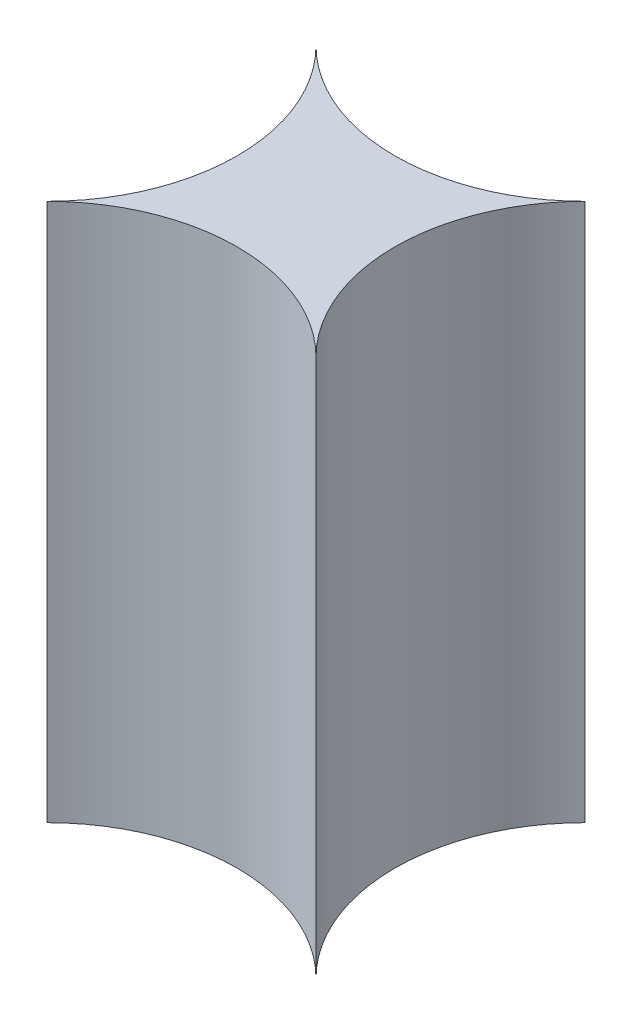
ISO-10303-21;
HEADER;
FILE_DESCRIPTION(('STEP AP214'),'2;1');
FILE_NAME('part.step','',(''),(''),'','','');
FILE_SCHEMA(('AUTOMOTIVE_DESIGN { 1 0 10303 214 1 1 1 1 }'));
ENDSEC;
DATA;
#1=APPLICATION_CONTEXT('core data for automotive mechanical design processes');
#2=APPLICATION_PROTOCOL_DEFINITION('international standard','automotive_design',2000,#1);
#3=PRODUCT_CONTEXT('',#1,'mechanical');
#4=PRODUCT('Part','Part','',(#3));
#5=PRODUCT_RELATED_PRODUCT_CATEGORY('part','',(#4));
#6=PRODUCT_DEFINITION_FORMATION('','',#4);
#7=PRODUCT_DEFINITION_CONTEXT('part definition',#1,'design');
#8=PRODUCT_DEFINITION('design','',#6,#7);
#9=PRODUCT_DEFINITION_SHAPE('','',#8);
#10=(LENGTH_UNIT() NAMED_UNIT(*) SI_UNIT(.MILLI.,.METRE.));
#11=(NAMED_UNIT(*) PLANE_ANGLE_UNIT() SI_UNIT($,.RADIAN.));
#12=(NAMED_UNIT(*) SI_UNIT($,.STERADIAN.) SOLID_ANGLE_UNIT());
#13=UNCERTAINTY_MEASURE_WITH_UNIT(LENGTH_MEASURE(1.E-05),#10,'distance_accuracy_value','');
#14=(GEOMETRIC_REPRESENTATION_CONTEXT(3) GLOBAL_UNCERTAINTY_ASSIGNED_CONTEXT((#13)) GLOBAL_UNIT_ASSIGNED_CONTEXT((#10,
#11,#12)) REPRESENTATION_CONTEXT('',''));
#15=CARTESIAN_POINT('',(0.,0.,0.));
#16=DIRECTION('',(0.,0.,1.));
#17=DIRECTION('',(1.,0.,0.));
#18=AXIS2_PLACEMENT_3D('',#15,#16,#17);
#19=CARTESIAN_POINT('',(0.,10.,-5.));
#20=DIRECTION('',(0.,-1.,0.));
#21=DIRECTION('',(0.,0.,-1.));
#22=AXIS2_PLACEMENT_3D('',#19,#20,#21);
#23=CYLINDRICAL_SURFACE('',#22,3.53553390593274);
#24=CARTESIAN_POINT('',(0.,0.,-5.));
#25=DIRECTION('',(0.,1.,0.));
#26=DIRECTION('',(0.,0.,1.));
#27=AXIS2_PLACEMENT_3D('',#24,#25,#26);
#28=CIRCLE('',#27,3.53553390593274);
#29=CARTESIAN_POINT('',(-2.5,0.,-2.5));
#30=VERTEX_POINT('',#29);
#31=CARTESIAN_POINT('',(2.5,0.,-2.50000000000001));
#32=VERTEX_POINT('',#31);
#33=EDGE_CURVE('E110',#30,#32,#28,.T.);
#34=ORIENTED_EDGE('',*,*,#33,.F.);
#35=DIRECTION('',(0.,-1.,0.));
#36=VECTOR('',#35,1.);
#37=CARTESIAN_POINT('',(-2.5,10.,-2.5));
#38=LINE('',#37,#36);
#39=CARTESIAN_POINT('',(-2.5,10.,-2.5));
#40=VERTEX_POINT('',#39);
#41=EDGE_CURVE('E11',#40,#30,#38,.T.);
#42=ORIENTED_EDGE('',*,*,#41,.F.);
#43=CARTESIAN_POINT('',(0.,10.,-5.));
#44=DIRECTION('',(0.,1.,0.));
#45=DIRECTION('',(0.,0.,1.));
#46=AXIS2_PLACEMENT_3D('',#43,#44,#45);
#47=CIRCLE('',#46,3.53553390593274);
#48=CARTESIAN_POINT('',(2.5,10.,-2.50000000000001));
#49=VERTEX_POINT('',#48);
#50=EDGE_CURVE('E103',#40,#49,#47,.T.);
#51=ORIENTED_EDGE('',*,*,#50,.T.);
#52=DIRECTION('',(0.,-1.,0.));
#53=VECTOR('',#52,1.);
#54=CARTESIAN_POINT('',(2.5,10.,-2.50000000000001));
#55=LINE('',#54,#53);
#56=EDGE_CURVE('E42',#49,#32,#55,.T.);
#57=ORIENTED_EDGE('',*,*,#56,.T.);
#58=EDGE_LOOP('',(#34,#42,#51,#57));
#59=FACE_BOUND('',#58,.T.);
#60=ADVANCED_FACE('F39',(#59),#23,.F.);
#61=CARTESIAN_POINT('',(-5.,10.,0.));
#62=DIRECTION('',(0.,-1.,0.));
#63=DIRECTION('',(0.,0.,-1.));
#64=AXIS2_PLACEMENT_3D('',#61,#62,#63);
#65=CYLINDRICAL_SURFACE('',#64,3.53553390593274);
#66=CARTESIAN_POINT('',(-5.,0.,0.));
#67=DIRECTION('',(0.,-1.,0.));
#68=DIRECTION('',(0.,0.,-1.));
#69=AXIS2_PLACEMENT_3D('',#66,#67,#68);
#70=CIRCLE('',#69,3.53553390593274);
#71=CARTESIAN_POINT('',(-2.49999999999999,0.,2.5));
#72=VERTEX_POINT('',#71);
#73=EDGE_CURVE('E73',#30,#72,#70,.T.);
#74=ORIENTED_EDGE('',*,*,#73,.T.);
#75=DIRECTION('',(0.,-1.,0.));
#76=VECTOR('',#75,1.);
#77=CARTESIAN_POINT('',(-2.49999999999999,10.,2.5));
#78=LINE('',#77,#76);
#79=CARTESIAN_POINT('',(-2.49999999999999,10.,2.5));
#80=VERTEX_POINT('',#79);
#81=EDGE_CURVE('E49',#80,#72,#78,.T.);
#82=ORIENTED_EDGE('',*,*,#81,.F.);
#83=CARTESIAN_POINT('',(-5.,10.,0.));
#84=DIRECTION('',(0.,-1.,0.));
#85=DIRECTION('',(0.,0.,-1.));
#86=AXIS2_PLACEMENT_3D('',#83,#84,#85);
#87=CIRCLE('',#86,3.53553390593274);
#88=EDGE_CURVE('E90',#40,#80,#87,.T.);
#89=ORIENTED_EDGE('',*,*,#88,.F.);
#90=ORIENTED_EDGE('',*,*,#41,.T.);
#91=EDGE_LOOP('',(#74,#82,#89,#90));
#92=FACE_BOUND('',#91,.T.);
#93=ADVANCED_FACE('F126',(#92),#65,.F.);
#94=CARTESIAN_POINT('',(0.,10.,5.));
#95=DIRECTION('',(0.,-1.,0.));
#96=DIRECTION('',(0.,0.,-1.));
#97=AXIS2_PLACEMENT_3D('',#94,#95,#96);
#98=CYLINDRICAL_SURFACE('',#97,3.53553390593274);
#99=CARTESIAN_POINT('',(0.,0.,5.));
#100=DIRECTION('',(0.,-1.,0.));
#101=DIRECTION('',(0.,0.,-1.));
#102=AXIS2_PLACEMENT_3D('',#99,#100,#101);
#103=CIRCLE('',#102,3.53553390593274);
#104=CARTESIAN_POINT('',(2.49999999999999,0.,2.5));
#105=VERTEX_POINT('',#104);
#106=EDGE_CURVE('E98',#72,#105,#103,.T.);
#107=ORIENTED_EDGE('',*,*,#106,.T.);
#108=DIRECTION('',(0.,-1.,0.));
#109=VECTOR('',#108,1.);
#110=CARTESIAN_POINT('',(2.49999999999999,10.,2.5));
#111=LINE('',#110,#109);
#112=CARTESIAN_POINT('',(2.49999999999999,10.,2.5));
#113=VERTEX_POINT('',#112);
#114=EDGE_CURVE('E95',#113,#105,#111,.T.);
#115=ORIENTED_EDGE('',*,*,#114,.F.);
#116=CARTESIAN_POINT('',(0.,10.,5.));
#117=DIRECTION('',(0.,-1.,0.));
#118=DIRECTION('',(0.,0.,-1.));
#119=AXIS2_PLACEMENT_3D('',#116,#117,#118);
#120=CIRCLE('',#119,3.53553390593274);
#121=EDGE_CURVE('E85',#80,#113,#120,.T.);
#122=ORIENTED_EDGE('',*,*,#121,.F.);
#123=ORIENTED_EDGE('',*,*,#81,.T.);
#124=EDGE_LOOP('',(#107,#115,#122,#123));
#125=FACE_BOUND('',#124,.T.);
#126=ADVANCED_FACE('F96',(#125),#98,.F.);
#127=CARTESIAN_POINT('',(5.,10.,0.));
#128=DIRECTION('',(0.,-1.,0.));
#129=DIRECTION('',(0.,0.,-1.));
#130=AXIS2_PLACEMENT_3D('',#127,#128,#129);
#131=CYLINDRICAL_SURFACE('',#130,3.53553390593274);
#132=CARTESIAN_POINT('',(5.,0.,0.));
#133=DIRECTION('',(0.,1.,0.));
#134=DIRECTION('',(0.,0.,1.));
#135=AXIS2_PLACEMENT_3D('',#132,#133,#134);
#136=CIRCLE('',#135,3.53553390593274);
#137=EDGE_CURVE('E114',#32,#105,#136,.T.);
#138=ORIENTED_EDGE('',*,*,#137,.F.);
#139=ORIENTED_EDGE('',*,*,#56,.F.);
#140=CARTESIAN_POINT('',(5.,10.,0.));
#141=DIRECTION('',(0.,1.,0.));
#142=DIRECTION('',(0.,0.,1.));
#143=AXIS2_PLACEMENT_3D('',#140,#141,#142);
#144=CIRCLE('',#143,3.53553390593274);
#145=EDGE_CURVE('E89',#49,#113,#144,.T.);
#146=ORIENTED_EDGE('',*,*,#145,.T.);
#147=ORIENTED_EDGE('',*,*,#114,.T.);
#148=EDGE_LOOP('',(#138,#139,#146,#147));
#149=FACE_BOUND('',#148,.T.);
#150=ADVANCED_FACE('F101',(#149),#131,.F.);
#151=CARTESIAN_POINT('',(2.5,10.,-2.5));
#152=DIRECTION('',(0.,1.,0.));
#153=DIRECTION('',(0.,0.,1.));
#154=AXIS2_PLACEMENT_3D('',#151,#152,#153);
#155=PLANE('',#154);
#156=ORIENTED_EDGE('',*,*,#50,.F.);
#157=ORIENTED_EDGE('',*,*,#88,.T.);
#158=ORIENTED_EDGE('',*,*,#121,.T.);
#159=ORIENTED_EDGE('',*,*,#145,.F.);
#160=EDGE_LOOP('',(#156,#157,#158,#159));
#161=FACE_BOUND('',#160,.T.);
#162=ADVANCED_FACE('F88',(#161),#155,.T.);
#163=CARTESIAN_POINT('',(2.5,0.,-2.5));
#164=DIRECTION('',(0.,1.,0.));
#165=DIRECTION('',(0.,0.,1.));
#166=AXIS2_PLACEMENT_3D('',#163,#164,#165);
#167=PLANE('',#166);
#168=ORIENTED_EDGE('',*,*,#33,.T.);
#169=ORIENTED_EDGE('',*,*,#137,.T.);
#170=ORIENTED_EDGE('',*,*,#106,.F.);
#171=ORIENTED_EDGE('',*,*,#73,.F.);
#172=EDGE_LOOP('',(#168,#169,#170,#171));
#173=FACE_BOUND('',#172,.T.);
#174=ADVANCED_FACE('F123',(#173),#167,.F.);
#175=CLOSED_SHELL('',(#60,#93,#126,#150,#162,#174));
#176=MANIFOLD_SOLID_BREP('B2',#175);
#177=ADVANCED_BREP_SHAPE_REPRESENTATION('',(#18,#176),#14);
#178=SHAPE_DEFINITION_REPRESENTATION(#9,#177);
ENDSEC;
END-ISO-10303-21;
